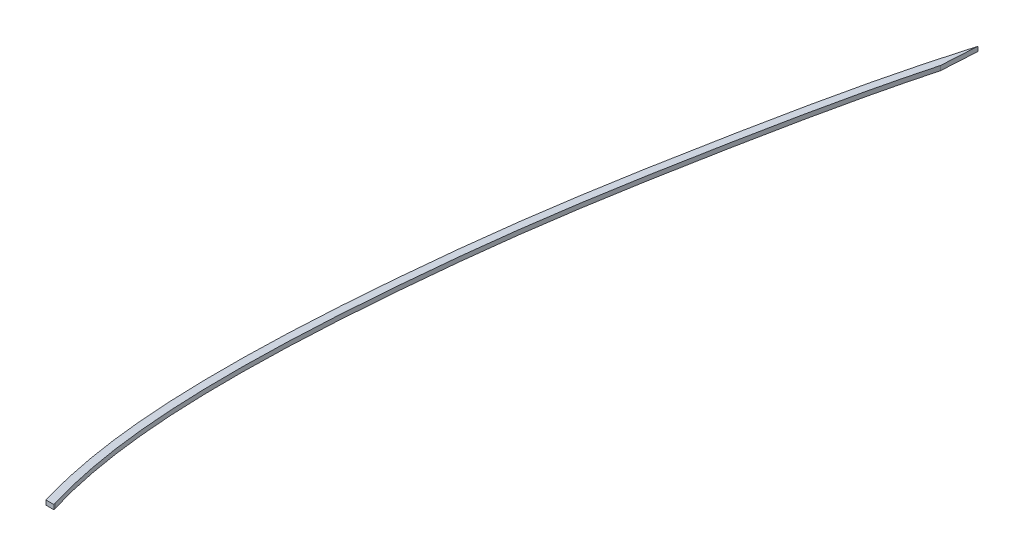
ISO-10303-21;
HEADER;
FILE_DESCRIPTION(('STEP AP214'),'2;1');
FILE_NAME('part.step','',(''),(''),'','','');
FILE_SCHEMA(('AUTOMOTIVE_DESIGN { 1 0 10303 214 1 1 1 1 }'));
ENDSEC;
DATA;
#1=APPLICATION_CONTEXT('core data for automotive mechanical design processes');
#2=APPLICATION_PROTOCOL_DEFINITION('international standard','automotive_design',2000,#1);
#3=PRODUCT_CONTEXT('',#1,'mechanical');
#4=PRODUCT('Part','Part','',(#3));
#5=PRODUCT_RELATED_PRODUCT_CATEGORY('part','',(#4));
#6=PRODUCT_DEFINITION_FORMATION('','',#4);
#7=PRODUCT_DEFINITION_CONTEXT('part definition',#1,'design');
#8=PRODUCT_DEFINITION('design','',#6,#7);
#9=PRODUCT_DEFINITION_SHAPE('','',#8);
#10=(LENGTH_UNIT() NAMED_UNIT(*) SI_UNIT(.MILLI.,.METRE.));
#11=(NAMED_UNIT(*) PLANE_ANGLE_UNIT() SI_UNIT($,.RADIAN.));
#12=(NAMED_UNIT(*) SI_UNIT($,.STERADIAN.) SOLID_ANGLE_UNIT());
#13=UNCERTAINTY_MEASURE_WITH_UNIT(LENGTH_MEASURE(1.E-05),#10,'distance_accuracy_value','');
#14=(GEOMETRIC_REPRESENTATION_CONTEXT(3) GLOBAL_UNCERTAINTY_ASSIGNED_CONTEXT((#13)) GLOBAL_UNIT_ASSIGNED_CONTEXT((#10,
#11,#12)) REPRESENTATION_CONTEXT('',''));
#15=CARTESIAN_POINT('',(0.,0.,0.));
#16=DIRECTION('',(0.,0.,1.));
#17=DIRECTION('',(1.,0.,0.));
#18=AXIS2_PLACEMENT_3D('',#15,#16,#17);
#19=CARTESIAN_POINT('',(-48.3860276005767,51.51,578.566789910098));
#20=CARTESIAN_POINT('',(-51.7803905777092,51.51,567.221947535091));
#21=CARTESIAN_POINT('',(-57.2557409873568,51.51,544.14493160308));
#22=CARTESIAN_POINT('',(-62.1493985599323,51.51,508.831952672008));
#23=CARTESIAN_POINT('',(-64.4124660304071,51.51,473.037439635886));
#24=CARTESIAN_POINT('',(-64.7598966344308,51.51,437.068166330361));
#25=CARTESIAN_POINT('',(-63.7493992276201,51.51,401.17131880639));
#26=CARTESIAN_POINT('',(-61.6036812100556,51.51,365.309028431765));
#27=CARTESIAN_POINT('',(-58.6505033054066,51.51,329.474788161962));
#28=CARTESIAN_POINT('',(-54.9638335848896,51.51,293.729962154829));
#29=CARTESIAN_POINT('',(-50.4583884916563,51.51,258.090690177414));
#30=CARTESIAN_POINT('',(-45.0528822931372,51.51,222.57128231239));
#31=CARTESIAN_POINT('',(-38.9125556620082,51.51,187.119022752939));
#32=CARTESIAN_POINT('',(-30.0510727146286,51.51,139.897301168071));
#33=CARTESIAN_POINT('',(-18.3112391186383,51.51,81.028811201786));
#34=CARTESIAN_POINT('',(-6.67209573514602,51.51,34.6231902843983));
#35=CARTESIAN_POINT('',(0.0669367747260448,51.51,11.6640707638457));
#36=B_SPLINE_CURVE_WITH_KNOTS('',3,(#19,#20,#21,#22,#23,#24,#25,#26,#27,#28,#29,#30,#31,#32,#33,
#34,#35),.UNSPECIFIED.,.F.,.F.,(4,1,1,1,1,1,1,1,1,1,1,1,1,1,4),(0.018209110906077,
0.0795710414744472,0.140932972042817,0.202294902611188,0.263656833179558,0.325018763747928,
0.386380694316298,0.447742624884668,0.509104555453039,0.570466486021409,0.631828416589779,
0.693190347158149,0.754552277726519,0.87727613886326,1.),.UNSPECIFIED.);
#37=DIRECTION('',(0.,-1.,0.));
#38=VECTOR('',#37,1.);
#39=SURFACE_OF_LINEAR_EXTRUSION('',#36,#38);
#40=CARTESIAN_POINT('',(-48.3860276005767,48.49,578.566789910098));
#41=CARTESIAN_POINT('',(-51.7803905777092,48.49,567.221947535091));
#42=CARTESIAN_POINT('',(-57.2557409873568,48.49,544.14493160308));
#43=CARTESIAN_POINT('',(-62.1493985599323,48.49,508.831952672008));
#44=CARTESIAN_POINT('',(-64.4124660304071,48.49,473.037439635886));
#45=CARTESIAN_POINT('',(-64.7598966344308,48.49,437.068166330361));
#46=CARTESIAN_POINT('',(-63.7493992276201,48.49,401.17131880639));
#47=CARTESIAN_POINT('',(-61.6036812100556,48.49,365.309028431765));
#48=CARTESIAN_POINT('',(-58.6505033054066,48.49,329.474788161962));
#49=CARTESIAN_POINT('',(-54.9638335848896,48.49,293.729962154829));
#50=CARTESIAN_POINT('',(-50.4583884916563,48.49,258.090690177414));
#51=CARTESIAN_POINT('',(-45.0528822931372,48.49,222.57128231239));
#52=CARTESIAN_POINT('',(-38.9125556620082,48.49,187.119022752939));
#53=CARTESIAN_POINT('',(-30.0510727146286,48.49,139.897301168071));
#54=CARTESIAN_POINT('',(-18.3112391186383,48.49,81.028811201786));
#55=CARTESIAN_POINT('',(-6.67209573514602,48.49,34.6231902843983));
#56=CARTESIAN_POINT('',(0.0669367747260448,48.49,11.6640707638457));
#57=B_SPLINE_CURVE_WITH_KNOTS('',3,(#40,#41,#42,#43,#44,#45,#46,#47,#48,#49,#50,#51,#52,#53,#54,
#55,#56),.UNSPECIFIED.,.F.,.F.,(4,1,1,1,1,1,1,1,1,1,1,1,1,1,4),(0.018209110906077,
0.0795710414744472,0.140932972042817,0.202294902611188,0.263656833179558,0.325018763747928,
0.386380694316298,0.447742624884668,0.509104555453039,0.570466486021409,0.631828416589779,
0.693190347158149,0.754552277726519,0.87727613886326,1.),.UNSPECIFIED.);
#58=CARTESIAN_POINT('',(-48.3860276005766,48.49,578.566789910098));
#59=VERTEX_POINT('',#58);
#60=CARTESIAN_POINT('',(-6.10955889503451,48.49,33.6943139109326));
#61=VERTEX_POINT('',#60);
#62=EDGE_CURVE('E113',#59,#61,#57,.T.);
#63=ORIENTED_EDGE('',*,*,#62,.T.);
#64=DIRECTION('',(0.,-1.,0.));
#65=VECTOR('',#64,1.);
#66=CARTESIAN_POINT('',(-6.10955889503451,51.51,33.6943139109326));
#67=LINE('',#66,#65);
#68=CARTESIAN_POINT('',(-6.10955889503451,51.51,33.6943139109326));
#69=VERTEX_POINT('',#68);
#70=EDGE_CURVE('E11',#69,#61,#67,.T.);
#71=ORIENTED_EDGE('',*,*,#70,.F.);
#72=CARTESIAN_POINT('',(-48.3860276005766,51.51,578.566789910098));
#73=VERTEX_POINT('',#72);
#74=EDGE_CURVE('E131',#73,#69,#36,.T.);
#75=ORIENTED_EDGE('',*,*,#74,.F.);
#76=DIRECTION('',(0.,-1.,0.));
#77=VECTOR('',#76,1.);
#78=CARTESIAN_POINT('',(-48.3860276005766,51.51,578.566789910098));
#79=LINE('',#78,#77);
#80=EDGE_CURVE('E106',#73,#59,#79,.T.);
#81=ORIENTED_EDGE('',*,*,#80,.T.);
#82=EDGE_LOOP('',(#63,#71,#75,#81));
#83=FACE_BOUND('',#82,.T.);
#84=ADVANCED_FACE('F35',(#83),#39,.F.);
#85=CARTESIAN_POINT('',(-4.72969832613487,51.51,10.2561218575484));
#86=DIRECTION('',(-0.99827151723526,0.,-0.0587705528033531));
#87=DIRECTION('',(-0.0587705528033531,0.,0.99827151723526));
#88=AXIS2_PLACEMENT_3D('',#85,#86,#87);
#89=PLANE('',#88);
#90=DIRECTION('',(0.0587705528033531,0.,-0.99827151723526));
#91=VECTOR('',#90,1.);
#92=CARTESIAN_POINT('',(-4.72969832613487,48.49,10.2561218575484));
#93=LINE('',#92,#91);
#94=CARTESIAN_POINT('',(-4.72969832613487,48.49,10.2561218575484));
#95=VERTEX_POINT('',#94);
#96=EDGE_CURVE('E118',#61,#95,#93,.T.);
#97=ORIENTED_EDGE('',*,*,#96,.T.);
#98=DIRECTION('',(0.,-1.,0.));
#99=VECTOR('',#98,1.);
#100=CARTESIAN_POINT('',(-4.72969832613487,51.51,10.2561218575484));
#101=LINE('',#100,#99);
#102=CARTESIAN_POINT('',(-4.72969832613487,51.51,10.2561218575484));
#103=VERTEX_POINT('',#102);
#104=EDGE_CURVE('E44',#103,#95,#101,.T.);
#105=ORIENTED_EDGE('',*,*,#104,.F.);
#106=DIRECTION('',(0.0587705528033531,0.,-0.99827151723526));
#107=VECTOR('',#106,1.);
#108=CARTESIAN_POINT('',(-4.72969832613487,51.51,10.2561218575484));
#109=LINE('',#108,#107);
#110=EDGE_CURVE('E86',#69,#103,#109,.T.);
#111=ORIENTED_EDGE('',*,*,#110,.F.);
#112=ORIENTED_EDGE('',*,*,#70,.T.);
#113=EDGE_LOOP('',(#97,#105,#111,#112));
#114=FACE_BOUND('',#113,.T.);
#115=ADVANCED_FACE('F150',(#114),#89,.F.);
#116=CARTESIAN_POINT('',(-4.72969832613487,51.51,10.2561218575484));
#117=CARTESIAN_POINT('',(-8.59723263997898,51.51,23.4322886438157));
#118=CARTESIAN_POINT('',(-21.0317157200477,51.51,69.6080629125404));
#119=CARTESIAN_POINT('',(-37.2950534859718,51.51,149.666311037929));
#120=CARTESIAN_POINT('',(-55.3462055023153,51.51,249.581342158538));
#121=CARTESIAN_POINT('',(-66.2349104757758,51.51,349.711613780141));
#122=CARTESIAN_POINT('',(-72.0321982639613,51.51,460.286609496219));
#123=CARTESIAN_POINT('',(-65.7535817129575,51.51,537.962915804208));
#124=CARTESIAN_POINT('',(-53.1762165329365,51.51,579.999999592));
#125=B_SPLINE_CURVE_WITH_KNOTS('',3,(#116,#117,#118,#119,#120,#121,#122,#123,#124),
.UNSPECIFIED.,.F.,.F.,(4,1,1,1,1,1,4),(0.018209110906077,0.0882789641743432,0.262319454469616,
0.434981473786181,0.606296405014112,0.776566769253324,1.),.UNSPECIFIED.);
#126=DIRECTION('',(0.,-1.,0.));
#127=VECTOR('',#126,1.);
#128=SURFACE_OF_LINEAR_EXTRUSION('',#125,#127);
#129=CARTESIAN_POINT('',(-4.72969832613487,48.49,10.2561218575484));
#130=CARTESIAN_POINT('',(-8.59723263997898,48.49,23.4322886438157));
#131=CARTESIAN_POINT('',(-21.0317157200477,48.49,69.6080629125404));
#132=CARTESIAN_POINT('',(-37.2950534859718,48.49,149.666311037929));
#133=CARTESIAN_POINT('',(-55.3462055023153,48.49,249.581342158538));
#134=CARTESIAN_POINT('',(-66.2349104757758,48.49,349.711613780141));
#135=CARTESIAN_POINT('',(-72.0321982639613,48.49,460.286609496219));
#136=CARTESIAN_POINT('',(-65.7535817129575,48.49,537.962915804208));
#137=CARTESIAN_POINT('',(-53.1762165329365,48.49,579.999999592));
#138=B_SPLINE_CURVE_WITH_KNOTS('',3,(#129,#130,#131,#132,#133,#134,#135,#136,#137),
.UNSPECIFIED.,.F.,.F.,(4,1,1,1,1,1,4),(0.018209110906077,0.0882789641743432,0.262319454469616,
0.434981473786181,0.606296405014112,0.776566769253324,1.),.UNSPECIFIED.);
#139=CARTESIAN_POINT('',(-53.1762165329365,48.49,579.999999592));
#140=VERTEX_POINT('',#139);
#141=EDGE_CURVE('E101',#95,#140,#138,.T.);
#142=ORIENTED_EDGE('',*,*,#141,.T.);
#143=DIRECTION('',(0.,-1.,0.));
#144=VECTOR('',#143,1.);
#145=CARTESIAN_POINT('',(-53.1762165329365,51.51,579.999999592));
#146=LINE('',#145,#144);
#147=CARTESIAN_POINT('',(-53.1762165329365,51.51,579.999999592));
#148=VERTEX_POINT('',#147);
#149=EDGE_CURVE('E98',#148,#140,#146,.T.);
#150=ORIENTED_EDGE('',*,*,#149,.F.);
#151=EDGE_CURVE('E90',#103,#148,#125,.T.);
#152=ORIENTED_EDGE('',*,*,#151,.F.);
#153=ORIENTED_EDGE('',*,*,#104,.T.);
#154=EDGE_LOOP('',(#142,#150,#152,#153));
#155=FACE_BOUND('',#154,.T.);
#156=ADVANCED_FACE('F99',(#155),#128,.F.);
#157=CARTESIAN_POINT('',(-47.9572157058244,51.51,579.999999592));
#158=DIRECTION('',(0.,0.,-1.));
#159=DIRECTION('',(-1.,0.,0.));
#160=AXIS2_PLACEMENT_3D('',#157,#158,#159);
#161=PLANE('',#160);
#162=DIRECTION('',(1.,0.,0.));
#163=VECTOR('',#162,1.);
#164=CARTESIAN_POINT('',(-47.9572157058244,48.49,579.999999592));
#165=LINE('',#164,#163);
#166=CARTESIAN_POINT('',(-47.9572157058244,48.49,579.999999592));
#167=VERTEX_POINT('',#166);
#168=EDGE_CURVE('E72',#140,#167,#165,.T.);
#169=ORIENTED_EDGE('',*,*,#168,.T.);
#170=DIRECTION('',(0.,-1.,0.));
#171=VECTOR('',#170,1.);
#172=CARTESIAN_POINT('',(-47.9572157058244,51.51,579.999999592));
#173=LINE('',#172,#171);
#174=CARTESIAN_POINT('',(-47.9572157058244,51.51,579.999999592));
#175=VERTEX_POINT('',#174);
#176=EDGE_CURVE('E102',#175,#167,#173,.T.);
#177=ORIENTED_EDGE('',*,*,#176,.F.);
#178=DIRECTION('',(1.,0.,0.));
#179=VECTOR('',#178,1.);
#180=CARTESIAN_POINT('',(-47.9572157058244,51.51,579.999999592));
#181=LINE('',#180,#179);
#182=EDGE_CURVE('E94',#148,#175,#181,.T.);
#183=ORIENTED_EDGE('',*,*,#182,.F.);
#184=ORIENTED_EDGE('',*,*,#149,.T.);
#185=EDGE_LOOP('',(#169,#177,#183,#184));
#186=FACE_BOUND('',#185,.T.);
#187=ADVANCED_FACE('F104',(#186),#161,.F.);
#188=CARTESIAN_POINT('',(-48.3860276005766,51.51,578.566789910098));
#189=DIRECTION('',(-0.958037786471617,0.,0.28664193638155));
#190=DIRECTION('',(0.28664193638155,0.,0.958037786471617));
#191=AXIS2_PLACEMENT_3D('',#188,#189,#190);
#192=PLANE('',#191);
#193=DIRECTION('',(-0.28664193638155,0.,-0.958037786471617));
#194=VECTOR('',#193,1.);
#195=CARTESIAN_POINT('',(-48.3860276005766,48.49,578.566789910098));
#196=LINE('',#195,#194);
#197=EDGE_CURVE('E78',#167,#59,#196,.T.);
#198=ORIENTED_EDGE('',*,*,#197,.T.);
#199=ORIENTED_EDGE('',*,*,#80,.F.);
#200=DIRECTION('',(-0.28664193638155,0.,-0.958037786471617));
#201=VECTOR('',#200,1.);
#202=CARTESIAN_POINT('',(-48.3860276005766,51.51,578.566789910098));
#203=LINE('',#202,#201);
#204=EDGE_CURVE('E52',#175,#73,#203,.T.);
#205=ORIENTED_EDGE('',*,*,#204,.F.);
#206=ORIENTED_EDGE('',*,*,#176,.T.);
#207=EDGE_LOOP('',(#198,#199,#205,#206));
#208=FACE_BOUND('',#207,.T.);
#209=ADVANCED_FACE('F139',(#208),#192,.F.);
#210=CARTESIAN_POINT('',(-54.8273710227702,51.51,293.747554493116));
#211=DIRECTION('',(0.,-1.,0.));
#212=DIRECTION('',(0.,0.,-1.));
#213=AXIS2_PLACEMENT_3D('',#210,#211,#212);
#214=PLANE('',#213);
#215=ORIENTED_EDGE('',*,*,#74,.T.);
#216=ORIENTED_EDGE('',*,*,#110,.T.);
#217=ORIENTED_EDGE('',*,*,#151,.T.);
#218=ORIENTED_EDGE('',*,*,#182,.T.);
#219=ORIENTED_EDGE('',*,*,#204,.T.);
#220=EDGE_LOOP('',(#215,#216,#217,#218,#219));
#221=FACE_BOUND('',#220,.T.);
#222=ADVANCED_FACE('F92',(#221),#214,.F.);
#223=CARTESIAN_POINT('',(-54.8273710227702,48.49,293.747554493116));
#224=DIRECTION('',(0.,-1.,0.));
#225=DIRECTION('',(0.,0.,-1.));
#226=AXIS2_PLACEMENT_3D('',#223,#224,#225);
#227=PLANE('',#226);
#228=ORIENTED_EDGE('',*,*,#62,.F.);
#229=ORIENTED_EDGE('',*,*,#197,.F.);
#230=ORIENTED_EDGE('',*,*,#168,.F.);
#231=ORIENTED_EDGE('',*,*,#141,.F.);
#232=ORIENTED_EDGE('',*,*,#96,.F.);
#233=EDGE_LOOP('',(#228,#229,#230,#231,#232));
#234=FACE_BOUND('',#233,.T.);
#235=ADVANCED_FACE('F135',(#234),#227,.T.);
#236=CLOSED_SHELL('',(#84,#115,#156,#187,#209,#222,#235));
#237=MANIFOLD_SOLID_BREP('B2',#236);
#238=ADVANCED_BREP_SHAPE_REPRESENTATION('',(#18,#237),#14);
#239=SHAPE_DEFINITION_REPRESENTATION(#9,#238);
ENDSEC;
END-ISO-10303-21;
